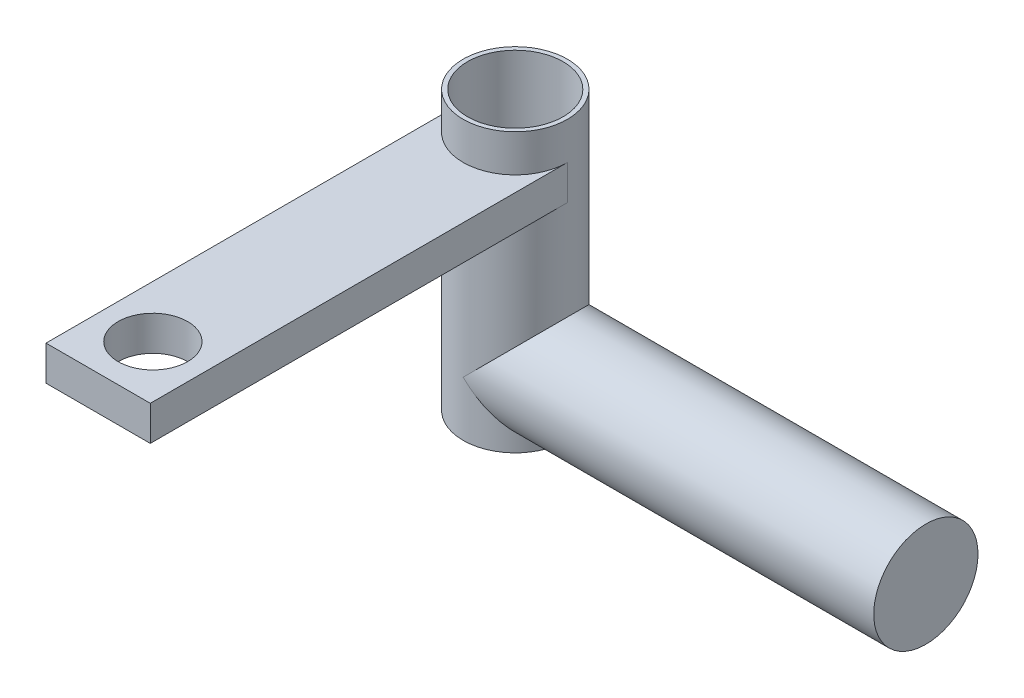
ISO-10303-21;
HEADER;
FILE_DESCRIPTION(('STEP AP214'),'2;1');
FILE_NAME('part.step','',(''),(''),'','','');
FILE_SCHEMA(('AUTOMOTIVE_DESIGN { 1 0 10303 214 1 1 1 1 }'));
ENDSEC;
DATA;
#1=APPLICATION_CONTEXT('core data for automotive mechanical design processes');
#2=APPLICATION_PROTOCOL_DEFINITION('international standard','automotive_design',2000,#1);
#3=PRODUCT_CONTEXT('',#1,'mechanical');
#4=PRODUCT('Part','Part','',(#3));
#5=PRODUCT_RELATED_PRODUCT_CATEGORY('part','',(#4));
#6=PRODUCT_DEFINITION_FORMATION('','',#4);
#7=PRODUCT_DEFINITION_CONTEXT('part definition',#1,'design');
#8=PRODUCT_DEFINITION('design','',#6,#7);
#9=PRODUCT_DEFINITION_SHAPE('','',#8);
#10=(LENGTH_UNIT() NAMED_UNIT(*) SI_UNIT(.MILLI.,.METRE.));
#11=(NAMED_UNIT(*) PLANE_ANGLE_UNIT() SI_UNIT($,.RADIAN.));
#12=(NAMED_UNIT(*) SI_UNIT($,.STERADIAN.) SOLID_ANGLE_UNIT());
#13=UNCERTAINTY_MEASURE_WITH_UNIT(LENGTH_MEASURE(1.E-05),#10,'distance_accuracy_value','');
#14=(GEOMETRIC_REPRESENTATION_CONTEXT(3) GLOBAL_UNCERTAINTY_ASSIGNED_CONTEXT((#13)) GLOBAL_UNIT_ASSIGNED_CONTEXT((#10,
#11,#12)) REPRESENTATION_CONTEXT('',''));
#15=CARTESIAN_POINT('',(0.,0.,0.));
#16=DIRECTION('',(0.,0.,1.));
#17=DIRECTION('',(1.,0.,0.));
#18=AXIS2_PLACEMENT_3D('',#15,#16,#17);
#19=CARTESIAN_POINT('',(0.,50.8,0.));
#20=DIRECTION('',(0.,-1.,0.));
#21=DIRECTION('',(0.,0.,-1.));
#22=AXIS2_PLACEMENT_3D('',#19,#20,#21);
#23=CYLINDRICAL_SURFACE('',#22,9.525);
#24=CARTESIAN_POINT('',(0.,37.625,0.));
#25=DIRECTION('',(0.,1.,0.));
#26=DIRECTION('',(0.,0.,1.));
#27=AXIS2_PLACEMENT_3D('',#24,#25,#26);
#28=CIRCLE('',#27,9.525);
#29=CARTESIAN_POINT('',(-9.525,37.625,0.));
#30=VERTEX_POINT('',#29);
#31=CARTESIAN_POINT('',(9.525,37.625,0.));
#32=VERTEX_POINT('',#31);
#33=EDGE_CURVE('E78',#30,#32,#28,.T.);
#34=ORIENTED_EDGE('',*,*,#33,.F.);
#35=DIRECTION('',(0.,-1.,0.));
#36=VECTOR('',#35,1.);
#37=CARTESIAN_POINT('',(-9.525,43.975,0.));
#38=LINE('',#37,#36);
#39=CARTESIAN_POINT('',(-9.525,43.975,0.));
#40=VERTEX_POINT('',#39);
#41=EDGE_CURVE('E107',#40,#30,#38,.T.);
#42=ORIENTED_EDGE('',*,*,#41,.F.);
#43=CARTESIAN_POINT('',(0.,43.975,0.));
#44=DIRECTION('',(0.,-1.,0.));
#45=DIRECTION('',(0.,0.,-1.));
#46=AXIS2_PLACEMENT_3D('',#43,#44,#45);
#47=CIRCLE('',#46,9.525);
#48=CARTESIAN_POINT('',(9.525,43.975,0.));
#49=VERTEX_POINT('',#48);
#50=EDGE_CURVE('E79',#49,#40,#47,.T.);
#51=ORIENTED_EDGE('',*,*,#50,.F.);
#52=DIRECTION('',(0.,1.,0.));
#53=VECTOR('',#52,1.);
#54=CARTESIAN_POINT('',(9.525,43.975,0.));
#55=LINE('',#54,#53);
#56=EDGE_CURVE('E104',#32,#49,#55,.T.);
#57=ORIENTED_EDGE('',*,*,#56,.F.);
#58=EDGE_LOOP('',(#34,#42,#51,#57));
#59=FACE_BOUND('',#58,.T.);
#60=CARTESIAN_POINT('',(0.,50.8,0.));
#61=DIRECTION('',(0.,1.,0.));
#62=DIRECTION('',(0.,0.,1.));
#63=AXIS2_PLACEMENT_3D('',#60,#61,#62);
#64=CIRCLE('',#63,9.525);
#65=CARTESIAN_POINT('',(0.,50.8,9.525));
#66=VERTEX_POINT('',#65);
#67=EDGE_CURVE('E88',#66,#66,#64,.T.);
#68=ORIENTED_EDGE('',*,*,#67,.F.);
#69=EDGE_LOOP('',(#68));
#70=FACE_BOUND('',#69,.T.);
#71=CARTESIAN_POINT('',(0.,0.,0.));
#72=DIRECTION('',(0.,1.,0.));
#73=DIRECTION('',(0.,0.,1.));
#74=AXIS2_PLACEMENT_3D('',#71,#72,#73);
#75=CIRCLE('',#74,9.525);
#76=CARTESIAN_POINT('',(0.,0.,9.525));
#77=VERTEX_POINT('',#76);
#78=EDGE_CURVE('E89',#77,#77,#75,.T.);
#79=ORIENTED_EDGE('',*,*,#78,.T.);
#80=EDGE_LOOP('',(#79));
#81=FACE_BOUND('',#80,.T.);
#82=CARTESIAN_POINT('',(0.,10.,0.));
#83=DIRECTION('',(-0.707106781186547,-0.707106781186547,0.));
#84=DIRECTION('',(0.707106781186547,-0.707106781186547,0.));
#85=AXIS2_PLACEMENT_3D('',#82,#83,#84);
#86=ELLIPSE('',#85,13.4703841816037,9.525);
#87=CARTESIAN_POINT('',(0.,10.,9.525));
#88=VERTEX_POINT('',#87);
#89=CARTESIAN_POINT('',(0.,10.,-9.525));
#90=VERTEX_POINT('',#89);
#91=EDGE_CURVE('E11',#88,#90,#86,.F.);
#92=ORIENTED_EDGE('',*,*,#91,.F.);
#93=CARTESIAN_POINT('',(0.,10.,0.));
#94=DIRECTION('',(0.707106781186547,-0.707106781186547,0.));
#95=DIRECTION('',(-0.707106781186547,-0.707106781186547,0.));
#96=AXIS2_PLACEMENT_3D('',#93,#94,#95);
#97=ELLIPSE('',#96,13.4703841816037,9.525);
#98=EDGE_CURVE('E40',#90,#88,#97,.T.);
#99=ORIENTED_EDGE('',*,*,#98,.F.);
#100=EDGE_LOOP('',(#92,#99));
#101=FACE_BOUND('',#100,.T.);
#102=ADVANCED_FACE('F33',(#59,#70,#81,#101),#23,.T.);
#103=CARTESIAN_POINT('',(0.,50.8,0.));
#104=DIRECTION('',(0.,1.,0.));
#105=DIRECTION('',(0.,0.,1.));
#106=AXIS2_PLACEMENT_3D('',#103,#104,#105);
#107=PLANE('',#106);
#108=CARTESIAN_POINT('',(0.,50.8,0.));
#109=DIRECTION('',(0.,1.,0.));
#110=DIRECTION('',(0.,0.,1.));
#111=AXIS2_PLACEMENT_3D('',#108,#109,#110);
#112=CIRCLE('',#111,8.73125);
#113=CARTESIAN_POINT('',(0.,50.8,8.73125));
#114=VERTEX_POINT('',#113);
#115=EDGE_CURVE('E120',#114,#114,#112,.T.);
#116=ORIENTED_EDGE('',*,*,#115,.F.);
#117=EDGE_LOOP('',(#116));
#118=FACE_BOUND('',#117,.T.);
#119=ORIENTED_EDGE('',*,*,#67,.T.);
#120=EDGE_LOOP('',(#119));
#121=FACE_BOUND('',#120,.T.);
#122=ADVANCED_FACE('F130',(#118,#121),#107,.T.);
#123=CARTESIAN_POINT('',(0.,0.,0.));
#124=DIRECTION('',(0.,1.,0.));
#125=DIRECTION('',(0.,0.,1.));
#126=AXIS2_PLACEMENT_3D('',#123,#124,#125);
#127=PLANE('',#126);
#128=CARTESIAN_POINT('',(0.,0.,0.));
#129=DIRECTION('',(0.,1.,0.));
#130=DIRECTION('',(0.,0.,1.));
#131=AXIS2_PLACEMENT_3D('',#128,#129,#130);
#132=CIRCLE('',#131,8.73125);
#133=CARTESIAN_POINT('',(0.,0.,8.73125));
#134=VERTEX_POINT('',#133);
#135=EDGE_CURVE('E121',#134,#134,#132,.T.);
#136=ORIENTED_EDGE('',*,*,#135,.T.);
#137=EDGE_LOOP('',(#136));
#138=FACE_BOUND('',#137,.T.);
#139=ORIENTED_EDGE('',*,*,#78,.F.);
#140=EDGE_LOOP('',(#139));
#141=FACE_BOUND('',#140,.T.);
#142=ADVANCED_FACE('F133',(#138,#141),#127,.F.);
#143=CARTESIAN_POINT('',(-9.525,43.975,76.2));
#144=DIRECTION('',(1.,0.,0.));
#145=DIRECTION('',(0.,0.,-1.));
#146=AXIS2_PLACEMENT_3D('',#143,#144,#145);
#147=PLANE('',#146);
#148=ORIENTED_EDGE('',*,*,#41,.T.);
#149=DIRECTION('',(0.,0.,-1.));
#150=VECTOR('',#149,1.);
#151=CARTESIAN_POINT('',(-9.525,37.625,76.2));
#152=LINE('',#151,#150);
#153=CARTESIAN_POINT('',(-9.525,37.625,76.2));
#154=VERTEX_POINT('',#153);
#155=EDGE_CURVE('E92',#154,#30,#152,.T.);
#156=ORIENTED_EDGE('',*,*,#155,.F.);
#157=DIRECTION('',(0.,-1.,0.));
#158=VECTOR('',#157,1.);
#159=CARTESIAN_POINT('',(-9.525,43.975,76.2));
#160=LINE('',#159,#158);
#161=CARTESIAN_POINT('',(-9.525,43.975,76.2));
#162=VERTEX_POINT('',#161);
#163=EDGE_CURVE('E106',#162,#154,#160,.T.);
#164=ORIENTED_EDGE('',*,*,#163,.F.);
#165=DIRECTION('',(0.,0.,-1.));
#166=VECTOR('',#165,1.);
#167=CARTESIAN_POINT('',(-9.525,43.975,76.2));
#168=LINE('',#167,#166);
#169=EDGE_CURVE('E52',#162,#40,#168,.T.);
#170=ORIENTED_EDGE('',*,*,#169,.T.);
#171=EDGE_LOOP('',(#148,#156,#164,#170));
#172=FACE_BOUND('',#171,.T.);
#173=ADVANCED_FACE('F143',(#172),#147,.F.);
#174=CARTESIAN_POINT('',(9.525,37.625,76.2));
#175=DIRECTION('',(0.,1.,0.));
#176=DIRECTION('',(0.,0.,1.));
#177=AXIS2_PLACEMENT_3D('',#174,#175,#176);
#178=PLANE('',#177);
#179=CARTESIAN_POINT('',(0.,37.625,66.2));
#180=DIRECTION('',(0.,1.,0.));
#181=DIRECTION('',(0.,0.,1.));
#182=AXIS2_PLACEMENT_3D('',#179,#180,#181);
#183=CIRCLE('',#182,6.35);
#184=CARTESIAN_POINT('',(0.,37.625,59.85));
#185=VERTEX_POINT('',#184);
#186=EDGE_CURVE('E84',#185,#185,#183,.F.);
#187=ORIENTED_EDGE('',*,*,#186,.F.);
#188=EDGE_LOOP('',(#187));
#189=FACE_BOUND('',#188,.T.);
#190=ORIENTED_EDGE('',*,*,#155,.T.);
#191=ORIENTED_EDGE('',*,*,#33,.T.);
#192=DIRECTION('',(0.,0.,-1.));
#193=VECTOR('',#192,1.);
#194=CARTESIAN_POINT('',(9.525,37.625,76.2));
#195=LINE('',#194,#193);
#196=CARTESIAN_POINT('',(9.525,37.625,76.2));
#197=VERTEX_POINT('',#196);
#198=EDGE_CURVE('E96',#197,#32,#195,.T.);
#199=ORIENTED_EDGE('',*,*,#198,.F.);
#200=DIRECTION('',(1.,0.,0.));
#201=VECTOR('',#200,1.);
#202=CARTESIAN_POINT('',(9.525,37.625,76.2));
#203=LINE('',#202,#201);
#204=EDGE_CURVE('E112',#154,#197,#203,.T.);
#205=ORIENTED_EDGE('',*,*,#204,.F.);
#206=EDGE_LOOP('',(#190,#191,#199,#205));
#207=FACE_BOUND('',#206,.T.);
#208=ADVANCED_FACE('F148',(#189,#207),#178,.F.);
#209=CARTESIAN_POINT('',(9.525,43.975,76.2));
#210=DIRECTION('',(-1.,0.,0.));
#211=DIRECTION('',(0.,0.,1.));
#212=AXIS2_PLACEMENT_3D('',#209,#210,#211);
#213=PLANE('',#212);
#214=ORIENTED_EDGE('',*,*,#56,.T.);
#215=DIRECTION('',(0.,0.,-1.));
#216=VECTOR('',#215,1.);
#217=CARTESIAN_POINT('',(9.525,43.975,76.2));
#218=LINE('',#217,#216);
#219=CARTESIAN_POINT('',(9.525,43.975,76.2));
#220=VERTEX_POINT('',#219);
#221=EDGE_CURVE('E99',#220,#49,#218,.T.);
#222=ORIENTED_EDGE('',*,*,#221,.F.);
#223=DIRECTION('',(0.,1.,0.));
#224=VECTOR('',#223,1.);
#225=CARTESIAN_POINT('',(9.525,43.975,76.2));
#226=LINE('',#225,#224);
#227=EDGE_CURVE('E110',#197,#220,#226,.T.);
#228=ORIENTED_EDGE('',*,*,#227,.F.);
#229=ORIENTED_EDGE('',*,*,#198,.T.);
#230=EDGE_LOOP('',(#214,#222,#228,#229));
#231=FACE_BOUND('',#230,.T.);
#232=ADVANCED_FACE('F153',(#231),#213,.F.);
#233=CARTESIAN_POINT('',(9.525,43.975,76.2));
#234=DIRECTION('',(0.,-1.,0.));
#235=DIRECTION('',(0.,0.,-1.));
#236=AXIS2_PLACEMENT_3D('',#233,#234,#235);
#237=PLANE('',#236);
#238=CARTESIAN_POINT('',(0.,43.975,66.2));
#239=DIRECTION('',(0.,-1.,0.));
#240=DIRECTION('',(0.,0.,-1.));
#241=AXIS2_PLACEMENT_3D('',#238,#239,#240);
#242=CIRCLE('',#241,6.35);
#243=CARTESIAN_POINT('',(0.,43.975,59.85));
#244=VERTEX_POINT('',#243);
#245=EDGE_CURVE('E82',#244,#244,#242,.F.);
#246=ORIENTED_EDGE('',*,*,#245,.F.);
#247=EDGE_LOOP('',(#246));
#248=FACE_BOUND('',#247,.T.);
#249=ORIENTED_EDGE('',*,*,#221,.T.);
#250=ORIENTED_EDGE('',*,*,#50,.T.);
#251=ORIENTED_EDGE('',*,*,#169,.F.);
#252=DIRECTION('',(-1.,0.,0.));
#253=VECTOR('',#252,1.);
#254=CARTESIAN_POINT('',(9.525,43.975,76.2));
#255=LINE('',#254,#253);
#256=EDGE_CURVE('E103',#220,#162,#255,.T.);
#257=ORIENTED_EDGE('',*,*,#256,.F.);
#258=EDGE_LOOP('',(#249,#250,#251,#257));
#259=FACE_BOUND('',#258,.T.);
#260=ADVANCED_FACE('F157',(#248,#259),#237,.F.);
#261=CARTESIAN_POINT('',(0.,0.,76.2));
#262=DIRECTION('',(0.,0.,-1.));
#263=DIRECTION('',(-1.,0.,0.));
#264=AXIS2_PLACEMENT_3D('',#261,#262,#263);
#265=PLANE('',#264);
#266=ORIENTED_EDGE('',*,*,#163,.T.);
#267=ORIENTED_EDGE('',*,*,#204,.T.);
#268=ORIENTED_EDGE('',*,*,#227,.T.);
#269=ORIENTED_EDGE('',*,*,#256,.T.);
#270=EDGE_LOOP('',(#266,#267,#268,#269));
#271=FACE_BOUND('',#270,.T.);
#272=ADVANCED_FACE('F161',(#271),#265,.F.);
#273=CARTESIAN_POINT('',(0.,50.8,66.2));
#274=DIRECTION('',(0.,-1.,0.));
#275=DIRECTION('',(0.,0.,-1.));
#276=AXIS2_PLACEMENT_3D('',#273,#274,#275);
#277=CYLINDRICAL_SURFACE('',#276,6.35);
#278=CARTESIAN_POINT('',(0.,43.975,59.85));
#279=CARTESIAN_POINT('',(0.,43.9088541666667,59.85));
#280=CARTESIAN_POINT('',(0.,43.8427083333333,59.85));
#281=CARTESIAN_POINT('',(0.,43.7104166666667,59.85));
#282=CARTESIAN_POINT('',(0.,43.6442708333333,59.85));
#283=CARTESIAN_POINT('',(0.,43.5119791666667,59.85));
#284=CARTESIAN_POINT('',(0.,43.4458333333333,59.85));
#285=CARTESIAN_POINT('',(0.,43.3135416666667,59.85));
#286=CARTESIAN_POINT('',(0.,43.2473958333333,59.85));
#287=CARTESIAN_POINT('',(0.,43.1151041666667,59.85));
#288=CARTESIAN_POINT('',(0.,43.0489583333333,59.85));
#289=CARTESIAN_POINT('',(0.,42.9166666666667,59.85));
#290=CARTESIAN_POINT('',(0.,42.8505208333333,59.85));
#291=CARTESIAN_POINT('',(0.,42.7182291666667,59.85));
#292=CARTESIAN_POINT('',(0.,42.6520833333333,59.85));
#293=CARTESIAN_POINT('',(0.,42.5197916666667,59.85));
#294=CARTESIAN_POINT('',(0.,42.4536458333333,59.85));
#295=CARTESIAN_POINT('',(0.,42.3213541666667,59.85));
#296=CARTESIAN_POINT('',(0.,42.2552083333333,59.85));
#297=CARTESIAN_POINT('',(0.,42.1229166666667,59.85));
#298=CARTESIAN_POINT('',(0.,42.0567708333333,59.85));
#299=CARTESIAN_POINT('',(0.,41.9244791666667,59.85));
#300=CARTESIAN_POINT('',(0.,41.8583333333333,59.85));
#301=CARTESIAN_POINT('',(0.,41.7260416666667,59.85));
#302=CARTESIAN_POINT('',(0.,41.6598958333333,59.85));
#303=CARTESIAN_POINT('',(0.,41.5276041666667,59.85));
#304=CARTESIAN_POINT('',(0.,41.4614583333333,59.85));
#305=CARTESIAN_POINT('',(0.,41.3291666666667,59.85));
#306=CARTESIAN_POINT('',(0.,41.2630208333333,59.85));
#307=CARTESIAN_POINT('',(0.,41.1307291666667,59.85));
#308=CARTESIAN_POINT('',(0.,41.0645833333333,59.85));
#309=CARTESIAN_POINT('',(0.,40.9322916666667,59.85));
#310=CARTESIAN_POINT('',(0.,40.8661458333333,59.85));
#311=CARTESIAN_POINT('',(0.,40.7338541666667,59.85));
#312=CARTESIAN_POINT('',(0.,40.6677083333333,59.85));
#313=CARTESIAN_POINT('',(0.,40.5354166666667,59.85));
#314=CARTESIAN_POINT('',(0.,40.4692708333333,59.85));
#315=CARTESIAN_POINT('',(0.,40.3369791666667,59.85));
#316=CARTESIAN_POINT('',(0.,40.2708333333333,59.85));
#317=CARTESIAN_POINT('',(0.,40.1385416666667,59.85));
#318=CARTESIAN_POINT('',(0.,40.0723958333333,59.85));
#319=CARTESIAN_POINT('',(0.,39.9401041666667,59.85));
#320=CARTESIAN_POINT('',(0.,39.8739583333333,59.85));
#321=CARTESIAN_POINT('',(0.,39.7416666666667,59.85));
#322=CARTESIAN_POINT('',(0.,39.6755208333333,59.85));
#323=CARTESIAN_POINT('',(0.,39.5432291666667,59.85));
#324=CARTESIAN_POINT('',(0.,39.4770833333333,59.85));
#325=CARTESIAN_POINT('',(0.,39.3447916666667,59.85));
#326=CARTESIAN_POINT('',(0.,39.2786458333333,59.85));
#327=CARTESIAN_POINT('',(0.,39.1463541666667,59.85));
#328=CARTESIAN_POINT('',(0.,39.0802083333333,59.85));
#329=CARTESIAN_POINT('',(0.,38.9479166666667,59.85));
#330=CARTESIAN_POINT('',(0.,38.8817708333333,59.85));
#331=CARTESIAN_POINT('',(0.,38.7494791666667,59.85));
#332=CARTESIAN_POINT('',(0.,38.6833333333333,59.85));
#333=CARTESIAN_POINT('',(0.,38.5510416666667,59.85));
#334=CARTESIAN_POINT('',(0.,38.4848958333333,59.85));
#335=CARTESIAN_POINT('',(0.,38.3526041666667,59.85));
#336=CARTESIAN_POINT('',(0.,38.2864583333333,59.85));
#337=CARTESIAN_POINT('',(0.,38.1541666666667,59.85));
#338=CARTESIAN_POINT('',(0.,38.0880208333333,59.85));
#339=CARTESIAN_POINT('',(0.,37.9557291666667,59.85));
#340=CARTESIAN_POINT('',(0.,37.8895833333333,59.85));
#341=CARTESIAN_POINT('',(0.,37.7572916666667,59.85));
#342=CARTESIAN_POINT('',(0.,37.6911458333333,59.85));
#343=CARTESIAN_POINT('',(0.,37.625,59.85));
#344=B_SPLINE_CURVE_WITH_KNOTS('',3,(#278,#279,#280,#281,#282,#283,#284,#285,#286,#287,#288,
#289,#290,#291,#292,#293,#294,#295,#296,#297,#298,#299,#300,#301,#302,#303,#304,#305,#306,#307,
#308,#309,#310,#311,#312,#313,#314,#315,#316,#317,#318,#319,#320,#321,#322,#323,#324,#325,#326,
#327,#328,#329,#330,#331,#332,#333,#334,#335,#336,#337,#338,#339,#340,#341,#342,#343),
.UNSPECIFIED.,.F.,.F.,(4,2,2,2,2,2,2,2,2,2,2,2,2,2,2,2,2,2,2,2,2,2,2,2,2,2,2,2,2,2,2,2,4),(0.,
0.198437499999995,0.396874999999998,0.5953125,0.793749999999996,0.992187499999998,1.190625,
1.3890625,1.5875,1.7859375,1.984375,2.18281250000001,2.38125,2.5796875,2.77812500000001,
2.9765625,3.175,3.37343750000001,3.571875,3.7703125,3.96875000000001,4.1671875,4.365625,
4.56406250000001,4.76250000000001,4.96093750000001,5.15937500000001,5.35781250000001,
5.55625000000001,5.75468750000001,5.95312500000001,6.15156250000001,6.35000000000001),.UNSPECIFIED.);
#345=EDGE_CURVE('BSEAM165',#244,#185,#344,.T.);
#346=ORIENTED_EDGE('',*,*,#245,.T.);
#347=ORIENTED_EDGE('',*,*,#186,.T.);
#348=ORIENTED_EDGE('',*,*,#345,.T.);
#349=ORIENTED_EDGE('',*,*,#345,.F.);
#350=EDGE_LOOP('',(#346,#348,#347,#349));
#351=FACE_BOUND('',#350,.T.);
#352=ADVANCED_FACE('F165',(#351),#277,.F.);
#353=CARTESIAN_POINT('',(75.,10.,0.));
#354=DIRECTION('',(-1.,0.,0.));
#355=DIRECTION('',(0.,0.,1.));
#356=AXIS2_PLACEMENT_3D('',#353,#354,#355);
#357=CYLINDRICAL_SURFACE('',#356,9.525);
#358=CARTESIAN_POINT('',(75.,10.,0.));
#359=DIRECTION('',(1.,0.,0.));
#360=DIRECTION('',(0.,0.,-1.));
#361=AXIS2_PLACEMENT_3D('',#358,#359,#360);
#362=CIRCLE('',#361,9.525);
#363=CARTESIAN_POINT('',(75.,10.,-9.525));
#364=VERTEX_POINT('',#363);
#365=EDGE_CURVE('E85',#364,#364,#362,.T.);
#366=ORIENTED_EDGE('',*,*,#365,.F.);
#367=EDGE_LOOP('',(#366));
#368=FACE_BOUND('',#367,.T.);
#369=ORIENTED_EDGE('',*,*,#98,.T.);
#370=ORIENTED_EDGE('',*,*,#91,.T.);
#371=EDGE_LOOP('',(#369,#370));
#372=FACE_BOUND('',#371,.T.);
#373=ADVANCED_FACE('F77',(#368,#372),#357,.T.);
#374=CARTESIAN_POINT('',(75.,10.,0.));
#375=DIRECTION('',(1.,0.,0.));
#376=DIRECTION('',(0.,0.,-1.));
#377=AXIS2_PLACEMENT_3D('',#374,#375,#376);
#378=PLANE('',#377);
#379=ORIENTED_EDGE('',*,*,#365,.T.);
#380=EDGE_LOOP('',(#379));
#381=FACE_BOUND('',#380,.T.);
#382=ADVANCED_FACE('F172',(#381),#378,.T.);
#383=CARTESIAN_POINT('',(0.,50.8,0.));
#384=DIRECTION('',(0.,-1.,0.));
#385=DIRECTION('',(0.,0.,-1.));
#386=AXIS2_PLACEMENT_3D('',#383,#384,#385);
#387=CYLINDRICAL_SURFACE('',#386,8.73125);
#388=ORIENTED_EDGE('',*,*,#115,.T.);
#389=EDGE_LOOP('',(#388));
#390=FACE_BOUND('',#389,.T.);
#391=ORIENTED_EDGE('',*,*,#135,.F.);
#392=EDGE_LOOP('',(#391));
#393=FACE_BOUND('',#392,.T.);
#394=ADVANCED_FACE('F127',(#390,#393),#387,.F.);
#395=CLOSED_SHELL('',(#102,#122,#142,#173,#208,#232,#260,#272,#352,#373,#382,#394));
#396=MANIFOLD_SOLID_BREP('B2',#395);
#397=ADVANCED_BREP_SHAPE_REPRESENTATION('',(#18,#396),#14);
#398=SHAPE_DEFINITION_REPRESENTATION(#9,#397);
ENDSEC;
END-ISO-10303-21;
